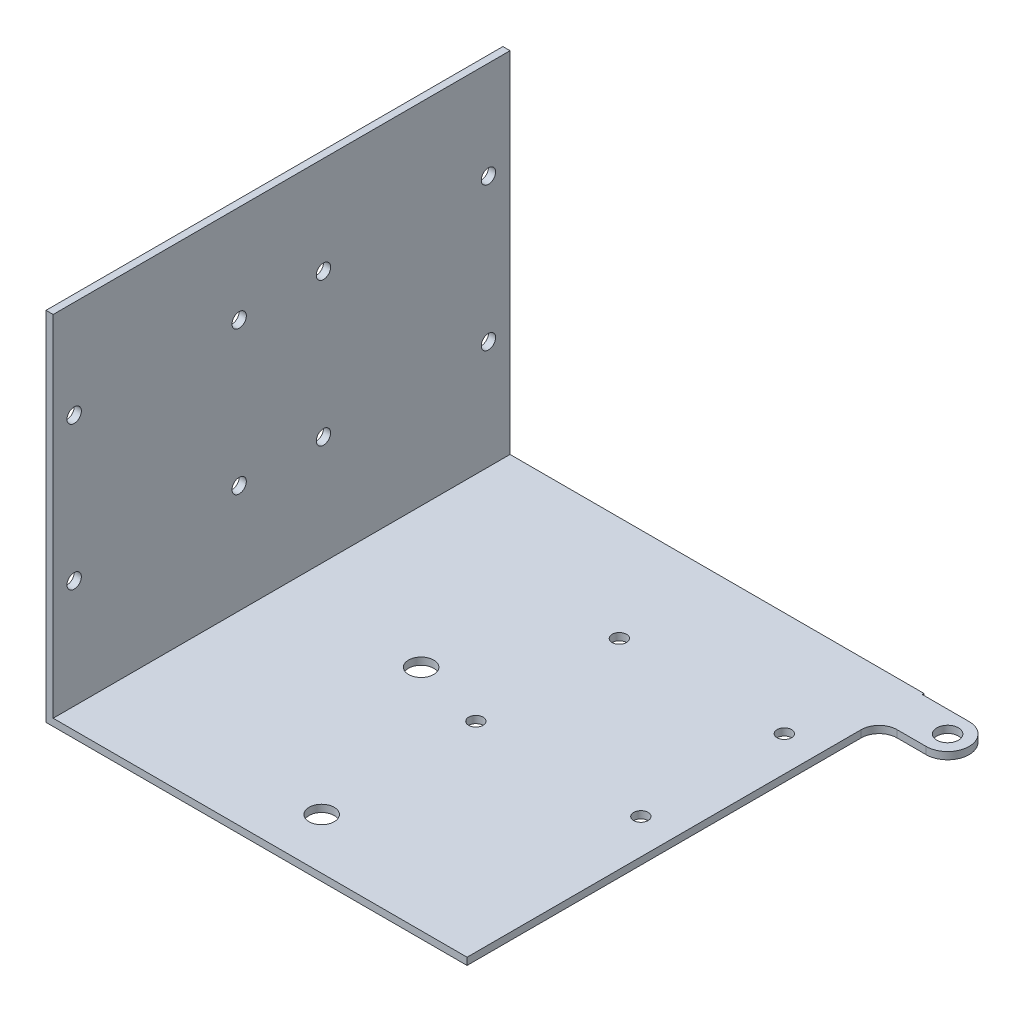
ISO-10303-21;
HEADER;
FILE_DESCRIPTION(('STEP AP214'),'2;1');
FILE_NAME('part.step','',(''),(''),'','','');
FILE_SCHEMA(('AUTOMOTIVE_DESIGN { 1 0 10303 214 1 1 1 1 }'));
ENDSEC;
DATA;
#1=APPLICATION_CONTEXT('core data for automotive mechanical design processes');
#2=APPLICATION_PROTOCOL_DEFINITION('international standard','automotive_design',2000,#1);
#3=PRODUCT_CONTEXT('',#1,'mechanical');
#4=PRODUCT('Part','Part','',(#3));
#5=PRODUCT_RELATED_PRODUCT_CATEGORY('part','',(#4));
#6=PRODUCT_DEFINITION_FORMATION('','',#4);
#7=PRODUCT_DEFINITION_CONTEXT('part definition',#1,'design');
#8=PRODUCT_DEFINITION('design','',#6,#7);
#9=PRODUCT_DEFINITION_SHAPE('','',#8);
#10=(LENGTH_UNIT() NAMED_UNIT(*) SI_UNIT(.MILLI.,.METRE.));
#11=(NAMED_UNIT(*) PLANE_ANGLE_UNIT() SI_UNIT($,.RADIAN.));
#12=(NAMED_UNIT(*) SI_UNIT($,.STERADIAN.) SOLID_ANGLE_UNIT());
#13=UNCERTAINTY_MEASURE_WITH_UNIT(LENGTH_MEASURE(1.E-05),#10,'distance_accuracy_value','');
#14=(GEOMETRIC_REPRESENTATION_CONTEXT(3) GLOBAL_UNCERTAINTY_ASSIGNED_CONTEXT((#13)) GLOBAL_UNIT_ASSIGNED_CONTEXT((#10,
#11,#12)) REPRESENTATION_CONTEXT('',''));
#15=CARTESIAN_POINT('',(0.,0.,0.));
#16=DIRECTION('',(0.,0.,1.));
#17=DIRECTION('',(1.,0.,0.));
#18=AXIS2_PLACEMENT_3D('',#15,#16,#17);
#19=CARTESIAN_POINT('',(117.4,0.,0.));
#20=DIRECTION('',(-1.,0.,0.));
#21=DIRECTION('',(0.,0.,1.));
#22=AXIS2_PLACEMENT_3D('',#19,#20,#21);
#23=PLANE('',#22);
#24=DIRECTION('',(0.,1.,0.));
#25=VECTOR('',#24,1.);
#26=CARTESIAN_POINT('',(117.4,-29.6240277392602,-63.1959832251231));
#27=LINE('',#26,#25);
#28=CARTESIAN_POINT('',(117.4,-29.6240277392602,-63.1959832251231));
#29=VERTEX_POINT('',#28);
#30=CARTESIAN_POINT('',(117.4,-27.6240277392602,-63.1959832251231));
#31=VERTEX_POINT('',#30);
#32=EDGE_CURVE('E134',#29,#31,#27,.T.);
#33=ORIENTED_EDGE('',*,*,#32,.F.);
#34=DIRECTION('',(0.,0.,-1.));
#35=VECTOR('',#34,1.);
#36=CARTESIAN_POINT('',(117.4,-29.6240277392602,63.6959832251231));
#37=LINE('',#36,#35);
#38=CARTESIAN_POINT('',(117.4,-29.6240277392602,-63.6959832251231));
#39=VERTEX_POINT('',#38);
#40=EDGE_CURVE('E144',#29,#39,#37,.T.);
#41=ORIENTED_EDGE('',*,*,#40,.T.);
#42=DIRECTION('',(0.,1.,0.));
#43=VECTOR('',#42,1.);
#44=CARTESIAN_POINT('',(117.4,-29.6240277392602,-63.6959832251231));
#45=LINE('',#44,#43);
#46=CARTESIAN_POINT('',(117.4,-27.6240277392602,-63.6959832251231));
#47=VERTEX_POINT('',#46);
#48=EDGE_CURVE('E196',#39,#47,#45,.T.);
#49=ORIENTED_EDGE('',*,*,#48,.T.);
#50=DIRECTION('',(0.,0.,1.));
#51=VECTOR('',#50,1.);
#52=CARTESIAN_POINT('',(117.4,-27.6240277392602,63.6959832251231));
#53=LINE('',#52,#51);
#54=EDGE_CURVE('E199',#47,#31,#53,.T.);
#55=ORIENTED_EDGE('',*,*,#54,.T.);
#56=EDGE_LOOP('',(#33,#41,#49,#55));
#57=FACE_BOUND('',#56,.T.);
#58=ADVANCED_FACE('F43',(#57),#23,.F.);
#59=CARTESIAN_POINT('',(2.,0.,0.));
#60=DIRECTION('',(-1.,0.,0.));
#61=DIRECTION('',(0.,0.,1.));
#62=AXIS2_PLACEMENT_3D('',#59,#60,#61);
#63=PLANE('',#62);
#64=CARTESIAN_POINT('',(2.,42.6259722605978,11.8369154729343));
#65=DIRECTION('',(1.,0.,0.));
#66=DIRECTION('',(0.,0.,1.));
#67=AXIS2_PLACEMENT_3D('',#64,#65,#66);
#68=CIRCLE('',#67,2.);
#69=CARTESIAN_POINT('',(2.,42.6259722605978,13.8369154729342));
#70=VERTEX_POINT('',#69);
#71=EDGE_CURVE('E212',#70,#70,#68,.T.);
#72=ORIENTED_EDGE('',*,*,#71,.F.);
#73=EDGE_LOOP('',(#72));
#74=FACE_BOUND('',#73,.T.);
#75=CARTESIAN_POINT('',(2.,42.6259722605972,57.8369154729342));
#76=DIRECTION('',(1.,0.,0.));
#77=DIRECTION('',(0.,0.,1.));
#78=AXIS2_PLACEMENT_3D('',#75,#76,#77);
#79=CIRCLE('',#78,2.);
#80=CARTESIAN_POINT('',(2.,42.6259722605972,59.8369154729342));
#81=VERTEX_POINT('',#80);
#82=EDGE_CURVE('E218',#81,#81,#79,.T.);
#83=ORIENTED_EDGE('',*,*,#82,.F.);
#84=EDGE_LOOP('',(#83));
#85=FACE_BOUND('',#84,.T.);
#86=CARTESIAN_POINT('',(2.,2.62597226059716,57.8369154729337));
#87=DIRECTION('',(1.,0.,0.));
#88=DIRECTION('',(0.,0.,1.));
#89=AXIS2_PLACEMENT_3D('',#86,#87,#88);
#90=CIRCLE('',#89,2.);
#91=CARTESIAN_POINT('',(2.,2.62597226059716,59.8369154729337));
#92=VERTEX_POINT('',#91);
#93=EDGE_CURVE('E224',#92,#92,#90,.T.);
#94=ORIENTED_EDGE('',*,*,#93,.F.);
#95=EDGE_LOOP('',(#94));
#96=FACE_BOUND('',#95,.T.);
#97=CARTESIAN_POINT('',(2.,2.62597226059716,11.8369154729342));
#98=DIRECTION('',(1.,0.,0.));
#99=DIRECTION('',(0.,0.,1.));
#100=AXIS2_PLACEMENT_3D('',#97,#98,#99);
#101=CIRCLE('',#100,2.);
#102=CARTESIAN_POINT('',(2.,2.62597226059716,13.8369154729342));
#103=VERTEX_POINT('',#102);
#104=EDGE_CURVE('E230',#103,#103,#101,.T.);
#105=ORIENTED_EDGE('',*,*,#104,.F.);
#106=EDGE_LOOP('',(#105));
#107=FACE_BOUND('',#106,.T.);
#108=CARTESIAN_POINT('',(2.,2.62597226059716,-11.6630845271803));
#109=DIRECTION('',(1.,0.,0.));
#110=DIRECTION('',(0.,0.,-1.));
#111=AXIS2_PLACEMENT_3D('',#108,#109,#110);
#112=CIRCLE('',#111,2.);
#113=CARTESIAN_POINT('',(2.,2.62597226059716,-13.6630845271803));
#114=VERTEX_POINT('',#113);
#115=EDGE_CURVE('E236',#114,#114,#112,.T.);
#116=ORIENTED_EDGE('',*,*,#115,.F.);
#117=EDGE_LOOP('',(#116));
#118=FACE_BOUND('',#117,.T.);
#119=CARTESIAN_POINT('',(2.,2.62597226059716,-57.6630845271798));
#120=DIRECTION('',(1.,0.,0.));
#121=DIRECTION('',(0.,0.,-1.));
#122=AXIS2_PLACEMENT_3D('',#119,#120,#121);
#123=CIRCLE('',#122,2.);
#124=CARTESIAN_POINT('',(2.,2.62597226059716,-59.6630845271798));
#125=VERTEX_POINT('',#124);
#126=EDGE_CURVE('E242',#125,#125,#123,.T.);
#127=ORIENTED_EDGE('',*,*,#126,.F.);
#128=EDGE_LOOP('',(#127));
#129=FACE_BOUND('',#128,.T.);
#130=CARTESIAN_POINT('',(2.,42.6259722605972,-57.6630845271803));
#131=DIRECTION('',(1.,0.,0.));
#132=DIRECTION('',(0.,0.,-1.));
#133=AXIS2_PLACEMENT_3D('',#130,#131,#132);
#134=CIRCLE('',#133,2.);
#135=CARTESIAN_POINT('',(2.,42.6259722605972,-59.6630845271803));
#136=VERTEX_POINT('',#135);
#137=EDGE_CURVE('E248',#136,#136,#134,.T.);
#138=ORIENTED_EDGE('',*,*,#137,.F.);
#139=EDGE_LOOP('',(#138));
#140=FACE_BOUND('',#139,.T.);
#141=CARTESIAN_POINT('',(2.,42.6259722605978,-11.6630845271803));
#142=DIRECTION('',(1.,0.,0.));
#143=DIRECTION('',(0.,0.,-1.));
#144=AXIS2_PLACEMENT_3D('',#141,#142,#143);
#145=CIRCLE('',#144,2.);
#146=CARTESIAN_POINT('',(2.,42.6259722605978,-13.6630845271803));
#147=VERTEX_POINT('',#146);
#148=EDGE_CURVE('E254',#147,#147,#145,.T.);
#149=ORIENTED_EDGE('',*,*,#148,.F.);
#150=EDGE_LOOP('',(#149));
#151=FACE_BOUND('',#150,.T.);
#152=DIRECTION('',(0.,0.,1.));
#153=VECTOR('',#152,1.);
#154=CARTESIAN_POINT('',(2.,-27.6240277392602,63.6959832251231));
#155=LINE('',#154,#153);
#156=CARTESIAN_POINT('',(2.,-27.6240277392602,-63.6959832251231));
#157=VERTEX_POINT('',#156);
#158=CARTESIAN_POINT('',(2.,-27.6240277392602,63.6959832251231));
#159=VERTEX_POINT('',#158);
#160=EDGE_CURVE('E192',#157,#159,#155,.T.);
#161=ORIENTED_EDGE('',*,*,#160,.F.);
#162=DIRECTION('',(0.,1.,0.));
#163=VECTOR('',#162,1.);
#164=CARTESIAN_POINT('',(2.,69.8758174176556,-63.6959832251231));
#165=LINE('',#164,#163);
#166=CARTESIAN_POINT('',(2.,69.8758174176556,-63.6959832251231));
#167=VERTEX_POINT('',#166);
#168=EDGE_CURVE('E260',#157,#167,#165,.T.);
#169=ORIENTED_EDGE('',*,*,#168,.T.);
#170=DIRECTION('',(0.,0.,1.));
#171=VECTOR('',#170,1.);
#172=CARTESIAN_POINT('',(2.,69.8758174176556,-63.6959832251231));
#173=LINE('',#172,#171);
#174=CARTESIAN_POINT('',(2.,69.8758174176556,63.6959832251231));
#175=VERTEX_POINT('',#174);
#176=EDGE_CURVE('E262',#167,#175,#173,.T.);
#177=ORIENTED_EDGE('',*,*,#176,.T.);
#178=DIRECTION('',(0.,-1.,0.));
#179=VECTOR('',#178,1.);
#180=CARTESIAN_POINT('',(2.,69.8758174176556,63.6959832251231));
#181=LINE('',#180,#179);
#182=EDGE_CURVE('E265',#175,#159,#181,.T.);
#183=ORIENTED_EDGE('',*,*,#182,.T.);
#184=EDGE_LOOP('',(#161,#169,#177,#183));
#185=FACE_BOUND('',#184,.T.);
#186=ADVANCED_FACE('F322',(#74,#85,#96,#107,#118,#129,#140,#151,#185),#63,.F.);
#187=CARTESIAN_POINT('',(0.,0.,0.));
#188=DIRECTION('',(-1.,0.,0.));
#189=DIRECTION('',(0.,0.,1.));
#190=AXIS2_PLACEMENT_3D('',#187,#188,#189);
#191=PLANE('',#190);
#192=CARTESIAN_POINT('',(0.,42.6259722605972,57.8369154729342));
#193=DIRECTION('',(1.,0.,0.));
#194=DIRECTION('',(0.,0.,1.));
#195=AXIS2_PLACEMENT_3D('',#192,#193,#194);
#196=CIRCLE('',#195,2.);
#197=CARTESIAN_POINT('',(0.,42.6259722605972,59.8369154729342));
#198=VERTEX_POINT('',#197);
#199=EDGE_CURVE('E215',#198,#198,#196,.T.);
#200=ORIENTED_EDGE('',*,*,#199,.T.);
#201=EDGE_LOOP('',(#200));
#202=FACE_BOUND('',#201,.T.);
#203=CARTESIAN_POINT('',(0.,2.62597226059716,11.8369154729342));
#204=DIRECTION('',(1.,0.,0.));
#205=DIRECTION('',(0.,0.,1.));
#206=AXIS2_PLACEMENT_3D('',#203,#204,#205);
#207=CIRCLE('',#206,2.);
#208=CARTESIAN_POINT('',(0.,2.62597226059716,13.8369154729342));
#209=VERTEX_POINT('',#208);
#210=EDGE_CURVE('E227',#209,#209,#207,.T.);
#211=ORIENTED_EDGE('',*,*,#210,.T.);
#212=EDGE_LOOP('',(#211));
#213=FACE_BOUND('',#212,.T.);
#214=CARTESIAN_POINT('',(0.,2.62597226059716,-57.6630845271798));
#215=DIRECTION('',(1.,0.,0.));
#216=DIRECTION('',(0.,0.,-1.));
#217=AXIS2_PLACEMENT_3D('',#214,#215,#216);
#218=CIRCLE('',#217,2.);
#219=CARTESIAN_POINT('',(0.,2.62597226059716,-59.6630845271798));
#220=VERTEX_POINT('',#219);
#221=EDGE_CURVE('E239',#220,#220,#218,.T.);
#222=ORIENTED_EDGE('',*,*,#221,.T.);
#223=EDGE_LOOP('',(#222));
#224=FACE_BOUND('',#223,.T.);
#225=CARTESIAN_POINT('',(0.,42.6259722605978,-11.6630845271803));
#226=DIRECTION('',(1.,0.,0.));
#227=DIRECTION('',(0.,0.,-1.));
#228=AXIS2_PLACEMENT_3D('',#225,#226,#227);
#229=CIRCLE('',#228,2.);
#230=CARTESIAN_POINT('',(0.,42.6259722605978,-13.6630845271803));
#231=VERTEX_POINT('',#230);
#232=EDGE_CURVE('E251',#231,#231,#229,.T.);
#233=ORIENTED_EDGE('',*,*,#232,.T.);
#234=EDGE_LOOP('',(#233));
#235=FACE_BOUND('',#234,.T.);
#236=DIRECTION('',(0.,1.,0.));
#237=VECTOR('',#236,1.);
#238=CARTESIAN_POINT('',(0.,69.8758174176556,-63.6959832251231));
#239=LINE('',#238,#237);
#240=CARTESIAN_POINT('',(0.,-29.6240277392602,-63.6959832251231));
#241=VERTEX_POINT('',#240);
#242=CARTESIAN_POINT('',(0.,69.8758174176556,-63.6959832251231));
#243=VERTEX_POINT('',#242);
#244=EDGE_CURVE('E257',#241,#243,#239,.T.);
#245=ORIENTED_EDGE('',*,*,#244,.F.);
#246=DIRECTION('',(0.,0.,-1.));
#247=VECTOR('',#246,1.);
#248=CARTESIAN_POINT('',(0.,-29.6240277392602,-63.6959832251231));
#249=LINE('',#248,#247);
#250=CARTESIAN_POINT('',(0.,-29.6240277392602,63.6959832251231));
#251=VERTEX_POINT('',#250);
#252=EDGE_CURVE('E263',#251,#241,#249,.T.);
#253=ORIENTED_EDGE('',*,*,#252,.F.);
#254=DIRECTION('',(0.,-1.,0.));
#255=VECTOR('',#254,1.);
#256=CARTESIAN_POINT('',(0.,69.8758174176556,63.6959832251231));
#257=LINE('',#256,#255);
#258=CARTESIAN_POINT('',(0.,69.8758174176556,63.6959832251231));
#259=VERTEX_POINT('',#258);
#260=EDGE_CURVE('E272',#259,#251,#257,.T.);
#261=ORIENTED_EDGE('',*,*,#260,.F.);
#262=DIRECTION('',(0.,0.,1.));
#263=VECTOR('',#262,1.);
#264=CARTESIAN_POINT('',(0.,69.8758174176556,-63.6959832251231));
#265=LINE('',#264,#263);
#266=EDGE_CURVE('E270',#243,#259,#265,.T.);
#267=ORIENTED_EDGE('',*,*,#266,.F.);
#268=EDGE_LOOP('',(#245,#253,#261,#267));
#269=FACE_BOUND('',#268,.T.);
#270=CARTESIAN_POINT('',(0.,42.6259722605972,-57.6630845271803));
#271=DIRECTION('',(1.,0.,0.));
#272=DIRECTION('',(0.,0.,-1.));
#273=AXIS2_PLACEMENT_3D('',#270,#271,#272);
#274=CIRCLE('',#273,2.);
#275=CARTESIAN_POINT('',(0.,42.6259722605972,-59.6630845271803));
#276=VERTEX_POINT('',#275);
#277=EDGE_CURVE('E245',#276,#276,#274,.T.);
#278=ORIENTED_EDGE('',*,*,#277,.T.);
#279=EDGE_LOOP('',(#278));
#280=FACE_BOUND('',#279,.T.);
#281=CARTESIAN_POINT('',(0.,2.62597226059716,-11.6630845271803));
#282=DIRECTION('',(1.,0.,0.));
#283=DIRECTION('',(0.,0.,-1.));
#284=AXIS2_PLACEMENT_3D('',#281,#282,#283);
#285=CIRCLE('',#284,2.);
#286=CARTESIAN_POINT('',(0.,2.62597226059716,-13.6630845271803));
#287=VERTEX_POINT('',#286);
#288=EDGE_CURVE('E233',#287,#287,#285,.T.);
#289=ORIENTED_EDGE('',*,*,#288,.T.);
#290=EDGE_LOOP('',(#289));
#291=FACE_BOUND('',#290,.T.);
#292=CARTESIAN_POINT('',(0.,2.62597226059716,57.8369154729337));
#293=DIRECTION('',(1.,0.,0.));
#294=DIRECTION('',(0.,0.,1.));
#295=AXIS2_PLACEMENT_3D('',#292,#293,#294);
#296=CIRCLE('',#295,2.);
#297=CARTESIAN_POINT('',(0.,2.62597226059716,59.8369154729337));
#298=VERTEX_POINT('',#297);
#299=EDGE_CURVE('E221',#298,#298,#296,.T.);
#300=ORIENTED_EDGE('',*,*,#299,.T.);
#301=EDGE_LOOP('',(#300));
#302=FACE_BOUND('',#301,.T.);
#303=CARTESIAN_POINT('',(0.,42.6259722605978,11.8369154729343));
#304=DIRECTION('',(1.,0.,0.));
#305=DIRECTION('',(0.,0.,1.));
#306=AXIS2_PLACEMENT_3D('',#303,#304,#305);
#307=CIRCLE('',#306,2.);
#308=CARTESIAN_POINT('',(0.,42.6259722605978,13.8369154729342));
#309=VERTEX_POINT('',#308);
#310=EDGE_CURVE('E211',#309,#309,#307,.T.);
#311=ORIENTED_EDGE('',*,*,#310,.T.);
#312=EDGE_LOOP('',(#311));
#313=FACE_BOUND('',#312,.T.);
#314=ADVANCED_FACE('F330',(#202,#213,#224,#235,#269,#280,#291,#302,#313),#191,.T.);
#315=CARTESIAN_POINT('',(2.,69.8758174176556,-63.6959832251231));
#316=DIRECTION('',(0.,0.,1.));
#317=DIRECTION('',(1.,0.,0.));
#318=AXIS2_PLACEMENT_3D('',#315,#316,#317);
#319=PLANE('',#318);
#320=ORIENTED_EDGE('',*,*,#244,.T.);
#321=DIRECTION('',(-1.,0.,0.));
#322=VECTOR('',#321,1.);
#323=CARTESIAN_POINT('',(2.,69.8758174176556,-63.6959832251231));
#324=LINE('',#323,#322);
#325=EDGE_CURVE('E283',#167,#243,#324,.T.);
#326=ORIENTED_EDGE('',*,*,#325,.F.);
#327=ORIENTED_EDGE('',*,*,#168,.F.);
#328=DIRECTION('',(-1.,0.,0.));
#329=VECTOR('',#328,1.);
#330=CARTESIAN_POINT('',(117.4,-27.6240277392602,-63.6959832251231));
#331=LINE('',#330,#329);
#332=EDGE_CURVE('E208',#47,#157,#331,.T.);
#333=ORIENTED_EDGE('',*,*,#332,.F.);
#334=ORIENTED_EDGE('',*,*,#48,.F.);
#335=DIRECTION('',(-1.,0.,0.));
#336=VECTOR('',#335,1.);
#337=CARTESIAN_POINT('',(2.,-29.6240277392602,-63.6959832251231));
#338=LINE('',#337,#336);
#339=EDGE_CURVE('E267',#39,#241,#338,.T.);
#340=ORIENTED_EDGE('',*,*,#339,.T.);
#341=EDGE_LOOP('',(#320,#326,#327,#333,#334,#340));
#342=FACE_BOUND('',#341,.T.);
#343=ADVANCED_FACE('F386',(#342),#319,.F.);
#344=CARTESIAN_POINT('',(2.,69.8758174176556,-63.6959832251231));
#345=DIRECTION('',(0.,-1.,0.));
#346=DIRECTION('',(0.,0.,-1.));
#347=AXIS2_PLACEMENT_3D('',#344,#345,#346);
#348=PLANE('',#347);
#349=ORIENTED_EDGE('',*,*,#266,.T.);
#350=DIRECTION('',(-1.,0.,0.));
#351=VECTOR('',#350,1.);
#352=CARTESIAN_POINT('',(2.,69.8758174176556,63.6959832251231));
#353=LINE('',#352,#351);
#354=EDGE_CURVE('E280',#175,#259,#353,.T.);
#355=ORIENTED_EDGE('',*,*,#354,.F.);
#356=ORIENTED_EDGE('',*,*,#176,.F.);
#357=ORIENTED_EDGE('',*,*,#325,.T.);
#358=EDGE_LOOP('',(#349,#355,#356,#357));
#359=FACE_BOUND('',#358,.T.);
#360=ADVANCED_FACE('F392',(#359),#348,.F.);
#361=CARTESIAN_POINT('',(2.,69.8758174176556,63.6959832251231));
#362=DIRECTION('',(0.,0.,-1.));
#363=DIRECTION('',(-1.,0.,0.));
#364=AXIS2_PLACEMENT_3D('',#361,#362,#363);
#365=PLANE('',#364);
#366=ORIENTED_EDGE('',*,*,#260,.T.);
#367=DIRECTION('',(-1.,0.,0.));
#368=VECTOR('',#367,1.);
#369=CARTESIAN_POINT('',(2.,-29.6240277392602,63.6959832251231));
#370=LINE('',#369,#368);
#371=CARTESIAN_POINT('',(117.4,-29.6240277392602,63.6959832251231));
#372=VERTEX_POINT('',#371);
#373=EDGE_CURVE('E277',#372,#251,#370,.T.);
#374=ORIENTED_EDGE('',*,*,#373,.F.);
#375=DIRECTION('',(0.,-1.,0.));
#376=VECTOR('',#375,1.);
#377=CARTESIAN_POINT('',(117.4,-29.6240277392602,63.6959832251231));
#378=LINE('',#377,#376);
#379=CARTESIAN_POINT('',(117.4,-27.6240277392602,63.6959832251231));
#380=VERTEX_POINT('',#379);
#381=EDGE_CURVE('E189',#380,#372,#378,.T.);
#382=ORIENTED_EDGE('',*,*,#381,.F.);
#383=DIRECTION('',(-1.,0.,0.));
#384=VECTOR('',#383,1.);
#385=CARTESIAN_POINT('',(117.4,-27.6240277392602,63.6959832251231));
#386=LINE('',#385,#384);
#387=EDGE_CURVE('E202',#380,#159,#386,.T.);
#388=ORIENTED_EDGE('',*,*,#387,.T.);
#389=ORIENTED_EDGE('',*,*,#182,.F.);
#390=ORIENTED_EDGE('',*,*,#354,.T.);
#391=EDGE_LOOP('',(#366,#374,#382,#388,#389,#390));
#392=FACE_BOUND('',#391,.T.);
#393=ADVANCED_FACE('F311',(#392),#365,.F.);
#394=CARTESIAN_POINT('',(2.,-29.6240277392602,-63.6959832251231));
#395=DIRECTION('',(0.,1.,0.));
#396=DIRECTION('',(0.,0.,1.));
#397=AXIS2_PLACEMENT_3D('',#394,#395,#396);
#398=PLANE('',#397);
#399=CARTESIAN_POINT('',(62.6699679748699,-29.6240277392602,49.5040167748774));
#400=DIRECTION('',(0.,1.,0.));
#401=DIRECTION('',(0.,0.,1.));
#402=AXIS2_PLACEMENT_3D('',#399,#400,#401);
#403=CIRCLE('',#402,3.50000000000001);
#404=CARTESIAN_POINT('',(62.6699679748699,-29.6240277392602,53.0040167748775));
#405=VERTEX_POINT('',#404);
#406=EDGE_CURVE('E165',#405,#405,#403,.T.);
#407=ORIENTED_EDGE('',*,*,#406,.T.);
#408=EDGE_LOOP('',(#407));
#409=FACE_BOUND('',#408,.T.);
#410=CARTESIAN_POINT('',(40.9905287898396,-29.6240277392602,0.0861680122466457));
#411=DIRECTION('',(0.,1.,0.));
#412=DIRECTION('',(0.,0.,1.));
#413=AXIS2_PLACEMENT_3D('',#410,#411,#412);
#414=CIRCLE('',#413,3.5);
#415=CARTESIAN_POINT('',(40.9905287898396,-29.6240277392602,3.58616801224665));
#416=VERTEX_POINT('',#415);
#417=EDGE_CURVE('E163',#416,#416,#414,.T.);
#418=ORIENTED_EDGE('',*,*,#417,.T.);
#419=EDGE_LOOP('',(#418));
#420=FACE_BOUND('',#419,.T.);
#421=CARTESIAN_POINT('',(107.65,-29.6240277392602,-34.5125559976324));
#422=DIRECTION('',(0.,1.,0.));
#423=DIRECTION('',(0.,0.,1.));
#424=AXIS2_PLACEMENT_3D('',#421,#422,#423);
#425=CIRCLE('',#424,2.);
#426=CARTESIAN_POINT('',(107.65,-29.6240277392602,-32.5125559976324));
#427=VERTEX_POINT('',#426);
#428=EDGE_CURVE('E168',#427,#427,#425,.T.);
#429=ORIENTED_EDGE('',*,*,#428,.T.);
#430=EDGE_LOOP('',(#429));
#431=FACE_BOUND('',#430,.T.);
#432=CARTESIAN_POINT('',(107.65,-29.6240277392602,5.48744400236763));
#433=DIRECTION('',(0.,1.,0.));
#434=DIRECTION('',(0.,0.,1.));
#435=AXIS2_PLACEMENT_3D('',#432,#433,#434);
#436=CIRCLE('',#435,2.);
#437=CARTESIAN_POINT('',(107.65,-29.6240277392602,7.48744400236763));
#438=VERTEX_POINT('',#437);
#439=EDGE_CURVE('E181',#438,#438,#436,.T.);
#440=ORIENTED_EDGE('',*,*,#439,.T.);
#441=EDGE_LOOP('',(#440));
#442=FACE_BOUND('',#441,.T.);
#443=CARTESIAN_POINT('',(61.65,-29.6240277392602,5.48744400236762));
#444=DIRECTION('',(0.,1.,0.));
#445=DIRECTION('',(0.,0.,1.));
#446=AXIS2_PLACEMENT_3D('',#443,#444,#445);
#447=CIRCLE('',#446,2.);
#448=CARTESIAN_POINT('',(61.65,-29.6240277392602,7.48744400236762));
#449=VERTEX_POINT('',#448);
#450=EDGE_CURVE('E177',#449,#449,#447,.T.);
#451=ORIENTED_EDGE('',*,*,#450,.T.);
#452=EDGE_LOOP('',(#451));
#453=FACE_BOUND('',#452,.T.);
#454=CARTESIAN_POINT('',(61.65,-29.6240277392602,-34.5125559976324));
#455=DIRECTION('',(0.,1.,0.));
#456=DIRECTION('',(0.,0.,1.));
#457=AXIS2_PLACEMENT_3D('',#454,#455,#456);
#458=CIRCLE('',#457,1.99999999999999);
#459=CARTESIAN_POINT('',(61.65,-29.6240277392602,-32.5125559976324));
#460=VERTEX_POINT('',#459);
#461=EDGE_CURVE('E180',#460,#460,#458,.T.);
#462=ORIENTED_EDGE('',*,*,#461,.T.);
#463=EDGE_LOOP('',(#462));
#464=FACE_BOUND('',#463,.T.);
#465=ORIENTED_EDGE('',*,*,#252,.T.);
#466=ORIENTED_EDGE('',*,*,#339,.F.);
#467=ORIENTED_EDGE('',*,*,#40,.F.);
#468=DIRECTION('',(-1.,0.,0.));
#469=VECTOR('',#468,1.);
#470=CARTESIAN_POINT('',(130.5,-29.6240277392602,-63.1959832251231));
#471=LINE('',#470,#469);
#472=CARTESIAN_POINT('',(130.5,-29.6240277392602,-63.1959832251231));
#473=VERTEX_POINT('',#472);
#474=EDGE_CURVE('E126',#473,#29,#471,.T.);
#475=ORIENTED_EDGE('',*,*,#474,.F.);
#476=CARTESIAN_POINT('',(130.5,-29.6240277392602,-57.1959832251231));
#477=DIRECTION('',(0.,1.,0.));
#478=DIRECTION('',(0.,0.,1.));
#479=AXIS2_PLACEMENT_3D('',#476,#477,#478);
#480=CIRCLE('',#479,6.);
#481=CARTESIAN_POINT('',(130.5,-29.6240277392602,-51.1959832251231));
#482=VERTEX_POINT('',#481);
#483=EDGE_CURVE('E142',#482,#473,#480,.T.);
#484=ORIENTED_EDGE('',*,*,#483,.F.);
#485=DIRECTION('',(1.,0.,0.));
#486=VECTOR('',#485,1.);
#487=CARTESIAN_POINT('',(130.5,-29.6240277392602,-51.1959832251231));
#488=LINE('',#487,#486);
#489=CARTESIAN_POINT('',(122.4,-29.6240277392602,-51.1959832251231));
#490=VERTEX_POINT('',#489);
#491=EDGE_CURVE('E135',#490,#482,#488,.T.);
#492=ORIENTED_EDGE('',*,*,#491,.F.);
#493=CARTESIAN_POINT('',(122.4,-29.6240277392602,-46.1959832251231));
#494=DIRECTION('',(0.,1.,0.));
#495=DIRECTION('',(0.,0.,1.));
#496=AXIS2_PLACEMENT_3D('',#493,#494,#495);
#497=CIRCLE('',#496,5.);
#498=CARTESIAN_POINT('',(117.4,-29.6240277392602,-46.1959832251231));
#499=VERTEX_POINT('',#498);
#500=EDGE_CURVE('E11',#490,#499,#497,.T.);
#501=ORIENTED_EDGE('',*,*,#500,.T.);
#502=EDGE_CURVE('E193',#372,#499,#37,.T.);
#503=ORIENTED_EDGE('',*,*,#502,.F.);
#504=ORIENTED_EDGE('',*,*,#373,.T.);
#505=EDGE_LOOP('',(#465,#466,#467,#475,#484,#492,#501,#503,#504));
#506=FACE_BOUND('',#505,.T.);
#507=CARTESIAN_POINT('',(130.5,-29.6240277392602,-57.1959832251231));
#508=DIRECTION('',(0.,1.,0.));
#509=DIRECTION('',(0.,0.,1.));
#510=AXIS2_PLACEMENT_3D('',#507,#508,#509);
#511=CIRCLE('',#510,2.99999999999999);
#512=CARTESIAN_POINT('',(130.5,-29.6240277392602,-54.1959832251231));
#513=VERTEX_POINT('',#512);
#514=EDGE_CURVE('E160',#513,#513,#511,.T.);
#515=ORIENTED_EDGE('',*,*,#514,.T.);
#516=EDGE_LOOP('',(#515));
#517=FACE_BOUND('',#516,.T.);
#518=ADVANCED_FACE('F140',(#409,#420,#431,#442,#453,#464,#506,#517),#398,.F.);
#519=CARTESIAN_POINT('',(2.,42.6259722605978,-11.6630845271803));
#520=DIRECTION('',(-1.,0.,0.));
#521=DIRECTION('',(0.,0.,1.));
#522=AXIS2_PLACEMENT_3D('',#519,#520,#521);
#523=CYLINDRICAL_SURFACE('',#522,2.);
#524=ORIENTED_EDGE('',*,*,#148,.T.);
#525=EDGE_LOOP('',(#524));
#526=FACE_BOUND('',#525,.T.);
#527=ORIENTED_EDGE('',*,*,#232,.F.);
#528=EDGE_LOOP('',(#527));
#529=FACE_BOUND('',#528,.T.);
#530=ADVANCED_FACE('F379',(#526,#529),#523,.F.);
#531=CARTESIAN_POINT('',(2.,42.6259722605972,-57.6630845271803));
#532=DIRECTION('',(-1.,0.,0.));
#533=DIRECTION('',(0.,0.,1.));
#534=AXIS2_PLACEMENT_3D('',#531,#532,#533);
#535=CYLINDRICAL_SURFACE('',#534,2.);
#536=ORIENTED_EDGE('',*,*,#137,.T.);
#537=EDGE_LOOP('',(#536));
#538=FACE_BOUND('',#537,.T.);
#539=ORIENTED_EDGE('',*,*,#277,.F.);
#540=EDGE_LOOP('',(#539));
#541=FACE_BOUND('',#540,.T.);
#542=ADVANCED_FACE('F375',(#538,#541),#535,.F.);
#543=CARTESIAN_POINT('',(2.,2.62597226059716,-57.6630845271798));
#544=DIRECTION('',(-1.,0.,0.));
#545=DIRECTION('',(0.,0.,1.));
#546=AXIS2_PLACEMENT_3D('',#543,#544,#545);
#547=CYLINDRICAL_SURFACE('',#546,2.);
#548=ORIENTED_EDGE('',*,*,#126,.T.);
#549=EDGE_LOOP('',(#548));
#550=FACE_BOUND('',#549,.T.);
#551=ORIENTED_EDGE('',*,*,#221,.F.);
#552=EDGE_LOOP('',(#551));
#553=FACE_BOUND('',#552,.T.);
#554=ADVANCED_FACE('F371',(#550,#553),#547,.F.);
#555=CARTESIAN_POINT('',(2.,2.62597226059716,-11.6630845271803));
#556=DIRECTION('',(-1.,0.,0.));
#557=DIRECTION('',(0.,0.,1.));
#558=AXIS2_PLACEMENT_3D('',#555,#556,#557);
#559=CYLINDRICAL_SURFACE('',#558,2.);
#560=ORIENTED_EDGE('',*,*,#115,.T.);
#561=EDGE_LOOP('',(#560));
#562=FACE_BOUND('',#561,.T.);
#563=ORIENTED_EDGE('',*,*,#288,.F.);
#564=EDGE_LOOP('',(#563));
#565=FACE_BOUND('',#564,.T.);
#566=ADVANCED_FACE('F367',(#562,#565),#559,.F.);
#567=CARTESIAN_POINT('',(2.,2.62597226059716,11.8369154729342));
#568=DIRECTION('',(-1.,0.,0.));
#569=DIRECTION('',(0.,0.,1.));
#570=AXIS2_PLACEMENT_3D('',#567,#568,#569);
#571=CYLINDRICAL_SURFACE('',#570,2.);
#572=ORIENTED_EDGE('',*,*,#104,.T.);
#573=EDGE_LOOP('',(#572));
#574=FACE_BOUND('',#573,.T.);
#575=ORIENTED_EDGE('',*,*,#210,.F.);
#576=EDGE_LOOP('',(#575));
#577=FACE_BOUND('',#576,.T.);
#578=ADVANCED_FACE('F363',(#574,#577),#571,.F.);
#579=CARTESIAN_POINT('',(2.,2.62597226059716,57.8369154729337));
#580=DIRECTION('',(-1.,0.,0.));
#581=DIRECTION('',(0.,0.,1.));
#582=AXIS2_PLACEMENT_3D('',#579,#580,#581);
#583=CYLINDRICAL_SURFACE('',#582,2.);
#584=ORIENTED_EDGE('',*,*,#93,.T.);
#585=EDGE_LOOP('',(#584));
#586=FACE_BOUND('',#585,.T.);
#587=ORIENTED_EDGE('',*,*,#299,.F.);
#588=EDGE_LOOP('',(#587));
#589=FACE_BOUND('',#588,.T.);
#590=ADVANCED_FACE('F359',(#586,#589),#583,.F.);
#591=CARTESIAN_POINT('',(2.,42.6259722605972,57.8369154729342));
#592=DIRECTION('',(-1.,0.,0.));
#593=DIRECTION('',(0.,0.,1.));
#594=AXIS2_PLACEMENT_3D('',#591,#592,#593);
#595=CYLINDRICAL_SURFACE('',#594,2.);
#596=ORIENTED_EDGE('',*,*,#82,.T.);
#597=EDGE_LOOP('',(#596));
#598=FACE_BOUND('',#597,.T.);
#599=ORIENTED_EDGE('',*,*,#199,.F.);
#600=EDGE_LOOP('',(#599));
#601=FACE_BOUND('',#600,.T.);
#602=ADVANCED_FACE('F351',(#598,#601),#595,.F.);
#603=CARTESIAN_POINT('',(2.,42.6259722605978,11.8369154729343));
#604=DIRECTION('',(-1.,0.,0.));
#605=DIRECTION('',(0.,0.,1.));
#606=AXIS2_PLACEMENT_3D('',#603,#604,#605);
#607=CYLINDRICAL_SURFACE('',#606,2.);
#608=ORIENTED_EDGE('',*,*,#71,.T.);
#609=EDGE_LOOP('',(#608));
#610=FACE_BOUND('',#609,.T.);
#611=ORIENTED_EDGE('',*,*,#310,.F.);
#612=EDGE_LOOP('',(#611));
#613=FACE_BOUND('',#612,.T.);
#614=ADVANCED_FACE('F345',(#610,#613),#607,.F.);
#615=CARTESIAN_POINT('',(117.4,-27.6240277392602,63.6959832251231));
#616=DIRECTION('',(0.,-1.,0.));
#617=DIRECTION('',(0.,0.,-1.));
#618=AXIS2_PLACEMENT_3D('',#615,#616,#617);
#619=PLANE('',#618);
#620=CARTESIAN_POINT('',(62.6699679748699,-27.6240277392602,49.5040167748774));
#621=DIRECTION('',(0.,1.,0.));
#622=DIRECTION('',(0.,0.,1.));
#623=AXIS2_PLACEMENT_3D('',#620,#621,#622);
#624=CIRCLE('',#623,3.50000000000001);
#625=CARTESIAN_POINT('',(62.6699679748699,-27.6240277392602,53.0040167748775));
#626=VERTEX_POINT('',#625);
#627=EDGE_CURVE('E169',#626,#626,#624,.T.);
#628=ORIENTED_EDGE('',*,*,#627,.F.);
#629=EDGE_LOOP('',(#628));
#630=FACE_BOUND('',#629,.T.);
#631=CARTESIAN_POINT('',(40.9905287898396,-27.6240277392602,0.0861680122466457));
#632=DIRECTION('',(0.,1.,0.));
#633=DIRECTION('',(0.,0.,1.));
#634=AXIS2_PLACEMENT_3D('',#631,#632,#633);
#635=CIRCLE('',#634,3.5);
#636=CARTESIAN_POINT('',(40.9905287898396,-27.6240277392602,3.58616801224665));
#637=VERTEX_POINT('',#636);
#638=EDGE_CURVE('E172',#637,#637,#635,.T.);
#639=ORIENTED_EDGE('',*,*,#638,.F.);
#640=EDGE_LOOP('',(#639));
#641=FACE_BOUND('',#640,.T.);
#642=CARTESIAN_POINT('',(107.65,-27.6240277392602,-34.5125559976324));
#643=DIRECTION('',(0.,-1.,0.));
#644=DIRECTION('',(0.,0.,-1.));
#645=AXIS2_PLACEMENT_3D('',#642,#643,#644);
#646=CIRCLE('',#645,2.);
#647=CARTESIAN_POINT('',(107.65,-27.6240277392602,-36.5125559976324));
#648=VERTEX_POINT('',#647);
#649=EDGE_CURVE('E205',#648,#648,#646,.T.);
#650=ORIENTED_EDGE('',*,*,#649,.T.);
#651=EDGE_LOOP('',(#650));
#652=FACE_BOUND('',#651,.T.);
#653=CARTESIAN_POINT('',(107.65,-27.6240277392602,5.48744400236763));
#654=DIRECTION('',(0.,-1.,0.));
#655=DIRECTION('',(0.,0.,-1.));
#656=AXIS2_PLACEMENT_3D('',#653,#654,#655);
#657=CIRCLE('',#656,2.);
#658=CARTESIAN_POINT('',(107.65,-27.6240277392602,3.48744400236763));
#659=VERTEX_POINT('',#658);
#660=EDGE_CURVE('E292',#659,#659,#657,.T.);
#661=ORIENTED_EDGE('',*,*,#660,.T.);
#662=EDGE_LOOP('',(#661));
#663=FACE_BOUND('',#662,.T.);
#664=CARTESIAN_POINT('',(61.65,-27.6240277392602,5.48744400236762));
#665=DIRECTION('',(0.,-1.,0.));
#666=DIRECTION('',(0.,0.,-1.));
#667=AXIS2_PLACEMENT_3D('',#664,#665,#666);
#668=CIRCLE('',#667,2.);
#669=CARTESIAN_POINT('',(61.65,-27.6240277392602,3.48744400236763));
#670=VERTEX_POINT('',#669);
#671=EDGE_CURVE('E289',#670,#670,#668,.T.);
#672=ORIENTED_EDGE('',*,*,#671,.T.);
#673=EDGE_LOOP('',(#672));
#674=FACE_BOUND('',#673,.T.);
#675=CARTESIAN_POINT('',(61.65,-27.6240277392602,-34.5125559976324));
#676=DIRECTION('',(0.,-1.,0.));
#677=DIRECTION('',(0.,0.,-1.));
#678=AXIS2_PLACEMENT_3D('',#675,#676,#677);
#679=CIRCLE('',#678,1.99999999999999);
#680=CARTESIAN_POINT('',(61.65,-27.6240277392602,-36.5125559976324));
#681=VERTEX_POINT('',#680);
#682=EDGE_CURVE('E188',#681,#681,#679,.T.);
#683=ORIENTED_EDGE('',*,*,#682,.T.);
#684=EDGE_LOOP('',(#683));
#685=FACE_BOUND('',#684,.T.);
#686=ORIENTED_EDGE('',*,*,#160,.T.);
#687=ORIENTED_EDGE('',*,*,#387,.F.);
#688=CARTESIAN_POINT('',(117.4,-27.6240277392602,-46.1959832251231));
#689=VERTEX_POINT('',#688);
#690=EDGE_CURVE('E198',#689,#380,#53,.T.);
#691=ORIENTED_EDGE('',*,*,#690,.F.);
#692=CARTESIAN_POINT('',(122.4,-27.6240277392602,-46.1959832251231));
#693=DIRECTION('',(0.,-1.,0.));
#694=DIRECTION('',(0.,0.,-1.));
#695=AXIS2_PLACEMENT_3D('',#692,#693,#694);
#696=CIRCLE('',#695,5.);
#697=CARTESIAN_POINT('',(122.4,-27.6240277392602,-51.1959832251231));
#698=VERTEX_POINT('',#697);
#699=EDGE_CURVE('E51',#689,#698,#696,.T.);
#700=ORIENTED_EDGE('',*,*,#699,.T.);
#701=DIRECTION('',(1.,0.,0.));
#702=VECTOR('',#701,1.);
#703=CARTESIAN_POINT('',(130.5,-27.6240277392602,-51.1959832251231));
#704=LINE('',#703,#702);
#705=CARTESIAN_POINT('',(130.5,-27.6240277392602,-51.1959832251231));
#706=VERTEX_POINT('',#705);
#707=EDGE_CURVE('E150',#698,#706,#704,.T.);
#708=ORIENTED_EDGE('',*,*,#707,.T.);
#709=CARTESIAN_POINT('',(130.5,-27.6240277392602,-57.1959832251231));
#710=DIRECTION('',(0.,1.,0.));
#711=DIRECTION('',(0.,0.,1.));
#712=AXIS2_PLACEMENT_3D('',#709,#710,#711);
#713=CIRCLE('',#712,6.);
#714=CARTESIAN_POINT('',(130.5,-27.6240277392602,-63.1959832251231));
#715=VERTEX_POINT('',#714);
#716=EDGE_CURVE('E158',#706,#715,#713,.T.);
#717=ORIENTED_EDGE('',*,*,#716,.T.);
#718=DIRECTION('',(-1.,0.,0.));
#719=VECTOR('',#718,1.);
#720=CARTESIAN_POINT('',(130.5,-27.6240277392602,-63.1959832251231));
#721=LINE('',#720,#719);
#722=EDGE_CURVE('E129',#715,#31,#721,.T.);
#723=ORIENTED_EDGE('',*,*,#722,.T.);
#724=ORIENTED_EDGE('',*,*,#54,.F.);
#725=ORIENTED_EDGE('',*,*,#332,.T.);
#726=EDGE_LOOP('',(#686,#687,#691,#700,#708,#717,#723,#724,#725));
#727=FACE_BOUND('',#726,.T.);
#728=CARTESIAN_POINT('',(130.5,-27.6240277392602,-57.1959832251231));
#729=DIRECTION('',(0.,1.,0.));
#730=DIRECTION('',(0.,0.,1.));
#731=AXIS2_PLACEMENT_3D('',#728,#729,#730);
#732=CIRCLE('',#731,2.99999999999999);
#733=CARTESIAN_POINT('',(130.5,-27.6240277392602,-54.1959832251231));
#734=VERTEX_POINT('',#733);
#735=EDGE_CURVE('E154',#734,#734,#732,.T.);
#736=ORIENTED_EDGE('',*,*,#735,.F.);
#737=EDGE_LOOP('',(#736));
#738=FACE_BOUND('',#737,.T.);
#739=ADVANCED_FACE('F306',(#630,#641,#652,#663,#674,#685,#727,#738),#619,.F.);
#740=ORIENTED_EDGE('',*,*,#502,.T.);
#741=DIRECTION('',(0.,1.,0.));
#742=VECTOR('',#741,1.);
#743=CARTESIAN_POINT('',(117.4,0.,-46.1959832251231));
#744=LINE('',#743,#742);
#745=EDGE_CURVE('E286',#499,#689,#744,.T.);
#746=ORIENTED_EDGE('',*,*,#745,.T.);
#747=ORIENTED_EDGE('',*,*,#690,.T.);
#748=ORIENTED_EDGE('',*,*,#381,.T.);
#749=EDGE_LOOP('',(#740,#746,#747,#748));
#750=FACE_BOUND('',#749,.T.);
#751=ADVANCED_FACE('F301',(#750),#23,.F.);
#752=CARTESIAN_POINT('',(61.65,-29.6240277392602,-34.5125559976324));
#753=DIRECTION('',(0.,1.,0.));
#754=DIRECTION('',(0.,0.,1.));
#755=AXIS2_PLACEMENT_3D('',#752,#753,#754);
#756=CYLINDRICAL_SURFACE('',#755,1.99999999999999);
#757=ORIENTED_EDGE('',*,*,#461,.F.);
#758=EDGE_LOOP('',(#757));
#759=FACE_BOUND('',#758,.T.);
#760=ORIENTED_EDGE('',*,*,#682,.F.);
#761=EDGE_LOOP('',(#760));
#762=FACE_BOUND('',#761,.T.);
#763=ADVANCED_FACE('F336',(#759,#762),#756,.F.);
#764=CARTESIAN_POINT('',(61.65,-29.6240277392602,5.48744400236762));
#765=DIRECTION('',(0.,1.,0.));
#766=DIRECTION('',(0.,0.,1.));
#767=AXIS2_PLACEMENT_3D('',#764,#765,#766);
#768=CYLINDRICAL_SURFACE('',#767,2.);
#769=ORIENTED_EDGE('',*,*,#450,.F.);
#770=EDGE_LOOP('',(#769));
#771=FACE_BOUND('',#770,.T.);
#772=ORIENTED_EDGE('',*,*,#671,.F.);
#773=EDGE_LOOP('',(#772));
#774=FACE_BOUND('',#773,.T.);
#775=ADVANCED_FACE('F342',(#771,#774),#768,.F.);
#776=CARTESIAN_POINT('',(107.65,-29.6240277392602,5.48744400236763));
#777=DIRECTION('',(0.,1.,0.));
#778=DIRECTION('',(0.,0.,1.));
#779=AXIS2_PLACEMENT_3D('',#776,#777,#778);
#780=CYLINDRICAL_SURFACE('',#779,2.);
#781=ORIENTED_EDGE('',*,*,#439,.F.);
#782=EDGE_LOOP('',(#781));
#783=FACE_BOUND('',#782,.T.);
#784=ORIENTED_EDGE('',*,*,#660,.F.);
#785=EDGE_LOOP('',(#784));
#786=FACE_BOUND('',#785,.T.);
#787=ADVANCED_FACE('F430',(#783,#786),#780,.F.);
#788=CARTESIAN_POINT('',(107.65,-29.6240277392602,-34.5125559976324));
#789=DIRECTION('',(0.,1.,0.));
#790=DIRECTION('',(0.,0.,1.));
#791=AXIS2_PLACEMENT_3D('',#788,#789,#790);
#792=CYLINDRICAL_SURFACE('',#791,2.);
#793=ORIENTED_EDGE('',*,*,#428,.F.);
#794=EDGE_LOOP('',(#793));
#795=FACE_BOUND('',#794,.T.);
#796=ORIENTED_EDGE('',*,*,#649,.F.);
#797=EDGE_LOOP('',(#796));
#798=FACE_BOUND('',#797,.T.);
#799=ADVANCED_FACE('F426',(#795,#798),#792,.F.);
#800=CARTESIAN_POINT('',(40.9905287898396,-29.6240277392602,0.0861680122466457));
#801=DIRECTION('',(0.,1.,0.));
#802=DIRECTION('',(0.,0.,1.));
#803=AXIS2_PLACEMENT_3D('',#800,#801,#802);
#804=CYLINDRICAL_SURFACE('',#803,3.5);
#805=ORIENTED_EDGE('',*,*,#417,.F.);
#806=EDGE_LOOP('',(#805));
#807=FACE_BOUND('',#806,.T.);
#808=ORIENTED_EDGE('',*,*,#638,.T.);
#809=EDGE_LOOP('',(#808));
#810=FACE_BOUND('',#809,.T.);
#811=ADVANCED_FACE('F423',(#807,#810),#804,.F.);
#812=CARTESIAN_POINT('',(62.6699679748699,-29.6240277392602,49.5040167748774));
#813=DIRECTION('',(0.,1.,0.));
#814=DIRECTION('',(0.,0.,1.));
#815=AXIS2_PLACEMENT_3D('',#812,#813,#814);
#816=CYLINDRICAL_SURFACE('',#815,3.50000000000001);
#817=ORIENTED_EDGE('',*,*,#406,.F.);
#818=EDGE_LOOP('',(#817));
#819=FACE_BOUND('',#818,.T.);
#820=ORIENTED_EDGE('',*,*,#627,.T.);
#821=EDGE_LOOP('',(#820));
#822=FACE_BOUND('',#821,.T.);
#823=ADVANCED_FACE('F418',(#819,#822),#816,.F.);
#824=CARTESIAN_POINT('',(130.5,-29.6240277392602,-57.1959832251231));
#825=DIRECTION('',(0.,1.,0.));
#826=DIRECTION('',(0.,0.,1.));
#827=AXIS2_PLACEMENT_3D('',#824,#825,#826);
#828=CYLINDRICAL_SURFACE('',#827,6.);
#829=ORIENTED_EDGE('',*,*,#716,.F.);
#830=DIRECTION('',(0.,1.,0.));
#831=VECTOR('',#830,1.);
#832=CARTESIAN_POINT('',(130.5,-29.6240277392602,-51.1959832251231));
#833=LINE('',#832,#831);
#834=EDGE_CURVE('E149',#482,#706,#833,.T.);
#835=ORIENTED_EDGE('',*,*,#834,.F.);
#836=ORIENTED_EDGE('',*,*,#483,.T.);
#837=DIRECTION('',(0.,1.,0.));
#838=VECTOR('',#837,1.);
#839=CARTESIAN_POINT('',(130.5,-29.6240277392602,-63.1959832251231));
#840=LINE('',#839,#838);
#841=EDGE_CURVE('E123',#473,#715,#840,.T.);
#842=ORIENTED_EDGE('',*,*,#841,.T.);
#843=EDGE_LOOP('',(#829,#835,#836,#842));
#844=FACE_BOUND('',#843,.T.);
#845=ADVANCED_FACE('F147',(#844),#828,.T.);
#846=CARTESIAN_POINT('',(130.5,-29.6240277392602,-51.1959832251231));
#847=DIRECTION('',(0.,0.,1.));
#848=DIRECTION('',(1.,0.,0.));
#849=AXIS2_PLACEMENT_3D('',#846,#847,#848);
#850=PLANE('',#849);
#851=ORIENTED_EDGE('',*,*,#707,.F.);
#852=DIRECTION('',(0.,1.,0.));
#853=VECTOR('',#852,1.);
#854=CARTESIAN_POINT('',(122.4,-29.6240277392602,-51.1959832251231));
#855=LINE('',#854,#853);
#856=EDGE_CURVE('E58',#698,#490,#855,.F.);
#857=ORIENTED_EDGE('',*,*,#856,.T.);
#858=ORIENTED_EDGE('',*,*,#491,.T.);
#859=ORIENTED_EDGE('',*,*,#834,.T.);
#860=EDGE_LOOP('',(#851,#857,#858,#859));
#861=FACE_BOUND('',#860,.T.);
#862=ADVANCED_FACE('F411',(#861),#850,.T.);
#863=CARTESIAN_POINT('',(130.5,-29.6240277392602,-63.1959832251231));
#864=DIRECTION('',(0.,0.,-1.));
#865=DIRECTION('',(-1.,0.,0.));
#866=AXIS2_PLACEMENT_3D('',#863,#864,#865);
#867=PLANE('',#866);
#868=ORIENTED_EDGE('',*,*,#722,.F.);
#869=ORIENTED_EDGE('',*,*,#841,.F.);
#870=ORIENTED_EDGE('',*,*,#474,.T.);
#871=ORIENTED_EDGE('',*,*,#32,.T.);
#872=EDGE_LOOP('',(#868,#869,#870,#871));
#873=FACE_BOUND('',#872,.T.);
#874=ADVANCED_FACE('F125',(#873),#867,.T.);
#875=CARTESIAN_POINT('',(130.5,-29.6240277392602,-57.1959832251231));
#876=DIRECTION('',(0.,1.,0.));
#877=DIRECTION('',(0.,0.,1.));
#878=AXIS2_PLACEMENT_3D('',#875,#876,#877);
#879=CYLINDRICAL_SURFACE('',#878,2.99999999999999);
#880=ORIENTED_EDGE('',*,*,#514,.F.);
#881=EDGE_LOOP('',(#880));
#882=FACE_BOUND('',#881,.T.);
#883=ORIENTED_EDGE('',*,*,#735,.T.);
#884=EDGE_LOOP('',(#883));
#885=FACE_BOUND('',#884,.T.);
#886=ADVANCED_FACE('F315',(#882,#885),#879,.F.);
#887=CARTESIAN_POINT('',(122.4,0.,-46.1959832251231));
#888=DIRECTION('',(0.,1.,0.));
#889=DIRECTION('',(0.,0.,1.));
#890=AXIS2_PLACEMENT_3D('',#887,#888,#889);
#891=CYLINDRICAL_SURFACE('',#890,5.);
#892=ORIENTED_EDGE('',*,*,#500,.F.);
#893=ORIENTED_EDGE('',*,*,#856,.F.);
#894=ORIENTED_EDGE('',*,*,#699,.F.);
#895=ORIENTED_EDGE('',*,*,#745,.F.);
#896=EDGE_LOOP('',(#892,#893,#894,#895));
#897=FACE_BOUND('',#896,.T.);
#898=ADVANCED_FACE('F45',(#897),#891,.F.);
#899=CLOSED_SHELL('',(#58,#186,#314,#343,#360,#393,#518,#530,#542,#554,#566,#578,#590,#602,#614,
#739,#751,#763,#775,#787,#799,#811,#823,#845,#862,#874,#886,#898));
#900=MANIFOLD_SOLID_BREP('B2',#899);
#901=ADVANCED_BREP_SHAPE_REPRESENTATION('',(#18,#900),#14);
#902=SHAPE_DEFINITION_REPRESENTATION(#9,#901);
ENDSEC;
END-ISO-10303-21;
